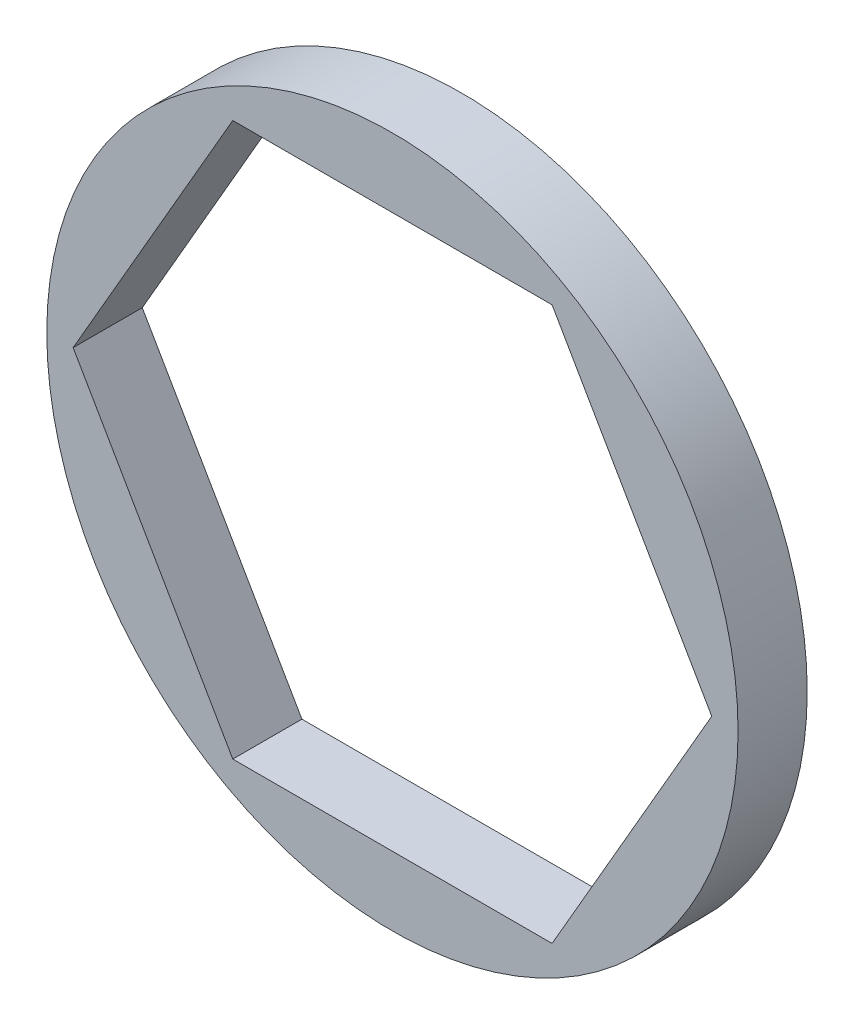
ISO-10303-21;
HEADER;
FILE_DESCRIPTION(('STEP AP214'),'2;1');
FILE_NAME('part.step','',(''),(''),'','','');
FILE_SCHEMA(('AUTOMOTIVE_DESIGN { 1 0 10303 214 1 1 1 1 }'));
ENDSEC;
DATA;
#1=APPLICATION_CONTEXT('core data for automotive mechanical design processes');
#2=APPLICATION_PROTOCOL_DEFINITION('international standard','automotive_design',2000,#1);
#3=PRODUCT_CONTEXT('',#1,'mechanical');
#4=PRODUCT('Part','Part','',(#3));
#5=PRODUCT_RELATED_PRODUCT_CATEGORY('part','',(#4));
#6=PRODUCT_DEFINITION_FORMATION('','',#4);
#7=PRODUCT_DEFINITION_CONTEXT('part definition',#1,'design');
#8=PRODUCT_DEFINITION('design','',#6,#7);
#9=PRODUCT_DEFINITION_SHAPE('','',#8);
#10=(LENGTH_UNIT() NAMED_UNIT(*) SI_UNIT(.MILLI.,.METRE.));
#11=(NAMED_UNIT(*) PLANE_ANGLE_UNIT() SI_UNIT($,.RADIAN.));
#12=(NAMED_UNIT(*) SI_UNIT($,.STERADIAN.) SOLID_ANGLE_UNIT());
#13=UNCERTAINTY_MEASURE_WITH_UNIT(LENGTH_MEASURE(1.E-05),#10,'distance_accuracy_value','');
#14=(GEOMETRIC_REPRESENTATION_CONTEXT(3) GLOBAL_UNCERTAINTY_ASSIGNED_CONTEXT((#13)) GLOBAL_UNIT_ASSIGNED_CONTEXT((#10,
#11,#12)) REPRESENTATION_CONTEXT('',''));
#15=CARTESIAN_POINT('',(0.,0.,0.));
#16=DIRECTION('',(0.,0.,1.));
#17=DIRECTION('',(1.,0.,0.));
#18=AXIS2_PLACEMENT_3D('',#15,#16,#17);
#19=CARTESIAN_POINT('',(0.,0.,1.5875));
#20=DIRECTION('',(0.,0.,1.));
#21=DIRECTION('',(1.,0.,0.));
#22=AXIS2_PLACEMENT_3D('',#19,#20,#21);
#23=PLANE('',#22);
#24=CARTESIAN_POINT('',(0.,0.,1.5875));
#25=DIRECTION('',(0.,0.,1.));
#26=DIRECTION('',(1.,0.,0.));
#27=AXIS2_PLACEMENT_3D('',#24,#25,#26);
#28=CIRCLE('',#27,7.9375);
#29=CARTESIAN_POINT('',(7.9375,0.,1.5875));
#30=VERTEX_POINT('',#29);
#31=EDGE_CURVE('E11',#30,#30,#28,.T.);
#32=ORIENTED_EDGE('',*,*,#31,.T.);
#33=EDGE_LOOP('',(#32));
#34=FACE_BOUND('',#33,.T.);
#35=DIRECTION('',(1.,0.,0.));
#36=VECTOR('',#35,1.);
#37=CARTESIAN_POINT('',(-3.66617420935412,-6.35,1.5875));
#38=LINE('',#37,#36);
#39=CARTESIAN_POINT('',(-3.66617420935412,-6.35,1.5875));
#40=VERTEX_POINT('',#39);
#41=CARTESIAN_POINT('',(3.66617420935412,-6.35,1.5875));
#42=VERTEX_POINT('',#41);
#43=EDGE_CURVE('E94',#40,#42,#38,.T.);
#44=ORIENTED_EDGE('',*,*,#43,.F.);
#45=DIRECTION('',(0.5,-0.866025403784438,0.));
#46=VECTOR('',#45,1.);
#47=CARTESIAN_POINT('',(-7.33234841870825,0.,1.5875));
#48=LINE('',#47,#46);
#49=CARTESIAN_POINT('',(-7.33234841870825,0.,1.5875));
#50=VERTEX_POINT('',#49);
#51=EDGE_CURVE('E86',#50,#40,#48,.T.);
#52=ORIENTED_EDGE('',*,*,#51,.F.);
#53=DIRECTION('',(-0.5,-0.866025403784439,0.));
#54=VECTOR('',#53,1.);
#55=CARTESIAN_POINT('',(-3.66617420935412,6.35,1.5875));
#56=LINE('',#55,#54);
#57=CARTESIAN_POINT('',(-3.66617420935412,6.35,1.5875));
#58=VERTEX_POINT('',#57);
#59=EDGE_CURVE('E114',#58,#50,#56,.T.);
#60=ORIENTED_EDGE('',*,*,#59,.F.);
#61=DIRECTION('',(-1.,0.,0.));
#62=VECTOR('',#61,1.);
#63=CARTESIAN_POINT('',(3.66617420935412,6.35,1.5875));
#64=LINE('',#63,#62);
#65=CARTESIAN_POINT('',(3.66617420935412,6.35,1.5875));
#66=VERTEX_POINT('',#65);
#67=EDGE_CURVE('E112',#66,#58,#64,.T.);
#68=ORIENTED_EDGE('',*,*,#67,.F.);
#69=DIRECTION('',(-0.5,0.866025403784438,0.));
#70=VECTOR('',#69,1.);
#71=CARTESIAN_POINT('',(7.33234841870824,0.,1.5875));
#72=LINE('',#71,#70);
#73=CARTESIAN_POINT('',(7.33234841870824,0.,1.5875));
#74=VERTEX_POINT('',#73);
#75=EDGE_CURVE('E108',#74,#66,#72,.T.);
#76=ORIENTED_EDGE('',*,*,#75,.F.);
#77=DIRECTION('',(0.5,0.866025403784439,0.));
#78=VECTOR('',#77,1.);
#79=CARTESIAN_POINT('',(3.66617420935412,-6.35,1.5875));
#80=LINE('',#79,#78);
#81=EDGE_CURVE('E106',#42,#74,#80,.T.);
#82=ORIENTED_EDGE('',*,*,#81,.F.);
#83=EDGE_LOOP('',(#44,#52,#60,#68,#76,#82));
#84=FACE_BOUND('',#83,.T.);
#85=ADVANCED_FACE('F33',(#34,#84),#23,.T.);
#86=CARTESIAN_POINT('',(0.,0.,0.));
#87=DIRECTION('',(0.,0.,1.));
#88=DIRECTION('',(1.,0.,0.));
#89=AXIS2_PLACEMENT_3D('',#86,#87,#88);
#90=PLANE('',#89);
#91=CARTESIAN_POINT('',(0.,0.,0.));
#92=DIRECTION('',(0.,0.,1.));
#93=DIRECTION('',(1.,0.,0.));
#94=AXIS2_PLACEMENT_3D('',#91,#92,#93);
#95=CIRCLE('',#94,7.9375);
#96=CARTESIAN_POINT('',(7.9375,0.,0.));
#97=VERTEX_POINT('',#96);
#98=EDGE_CURVE('E37',#97,#97,#95,.T.);
#99=ORIENTED_EDGE('',*,*,#98,.F.);
#100=EDGE_LOOP('',(#99));
#101=FACE_BOUND('',#100,.T.);
#102=DIRECTION('',(0.5,-0.866025403784438,0.));
#103=VECTOR('',#102,1.);
#104=CARTESIAN_POINT('',(-7.33234841870825,0.,0.));
#105=LINE('',#104,#103);
#106=CARTESIAN_POINT('',(-7.33234841870825,0.,0.));
#107=VERTEX_POINT('',#106);
#108=CARTESIAN_POINT('',(-3.66617420935412,-6.35,0.));
#109=VERTEX_POINT('',#108);
#110=EDGE_CURVE('E56',#107,#109,#105,.T.);
#111=ORIENTED_EDGE('',*,*,#110,.T.);
#112=DIRECTION('',(1.,0.,0.));
#113=VECTOR('',#112,1.);
#114=CARTESIAN_POINT('',(-3.66617420935412,-6.35,0.));
#115=LINE('',#114,#113);
#116=CARTESIAN_POINT('',(3.66617420935412,-6.35,0.));
#117=VERTEX_POINT('',#116);
#118=EDGE_CURVE('E101',#109,#117,#115,.T.);
#119=ORIENTED_EDGE('',*,*,#118,.T.);
#120=DIRECTION('',(0.5,0.866025403784439,0.));
#121=VECTOR('',#120,1.);
#122=CARTESIAN_POINT('',(3.66617420935412,-6.35,0.));
#123=LINE('',#122,#121);
#124=CARTESIAN_POINT('',(7.33234841870824,0.,0.));
#125=VERTEX_POINT('',#124);
#126=EDGE_CURVE('E118',#117,#125,#123,.T.);
#127=ORIENTED_EDGE('',*,*,#126,.T.);
#128=DIRECTION('',(-0.5,0.866025403784438,0.));
#129=VECTOR('',#128,1.);
#130=CARTESIAN_POINT('',(7.33234841870824,0.,0.));
#131=LINE('',#130,#129);
#132=CARTESIAN_POINT('',(3.66617420935412,6.35,0.));
#133=VERTEX_POINT('',#132);
#134=EDGE_CURVE('E121',#125,#133,#131,.T.);
#135=ORIENTED_EDGE('',*,*,#134,.T.);
#136=DIRECTION('',(-1.,0.,0.));
#137=VECTOR('',#136,1.);
#138=CARTESIAN_POINT('',(3.66617420935412,6.35,0.));
#139=LINE('',#138,#137);
#140=CARTESIAN_POINT('',(-3.66617420935412,6.35,0.));
#141=VERTEX_POINT('',#140);
#142=EDGE_CURVE('E124',#133,#141,#139,.T.);
#143=ORIENTED_EDGE('',*,*,#142,.T.);
#144=DIRECTION('',(-0.5,-0.866025403784439,0.));
#145=VECTOR('',#144,1.);
#146=CARTESIAN_POINT('',(-3.66617420935412,6.35,0.));
#147=LINE('',#146,#145);
#148=EDGE_CURVE('E95',#141,#107,#147,.T.);
#149=ORIENTED_EDGE('',*,*,#148,.T.);
#150=EDGE_LOOP('',(#111,#119,#127,#135,#143,#149));
#151=FACE_BOUND('',#150,.T.);
#152=ADVANCED_FACE('F141',(#101,#151),#90,.F.);
#153=CARTESIAN_POINT('',(0.,0.,1.5875));
#154=DIRECTION('',(0.,0.,-1.));
#155=DIRECTION('',(-1.,0.,0.));
#156=AXIS2_PLACEMENT_3D('',#153,#154,#155);
#157=CYLINDRICAL_SURFACE('',#156,7.9375);
#158=ORIENTED_EDGE('',*,*,#31,.F.);
#159=EDGE_LOOP('',(#158));
#160=FACE_BOUND('',#159,.T.);
#161=ORIENTED_EDGE('',*,*,#98,.T.);
#162=EDGE_LOOP('',(#161));
#163=FACE_BOUND('',#162,.T.);
#164=ADVANCED_FACE('F35',(#160,#163),#157,.T.);
#165=CARTESIAN_POINT('',(-7.33234841870825,0.,1.5875));
#166=DIRECTION('',(0.866025403784439,0.5,0.));
#167=DIRECTION('',(-0.5,0.866025403784439,0.));
#168=AXIS2_PLACEMENT_3D('',#165,#166,#167);
#169=PLANE('',#168);
#170=ORIENTED_EDGE('',*,*,#110,.F.);
#171=DIRECTION('',(0.,0.,-1.));
#172=VECTOR('',#171,1.);
#173=CARTESIAN_POINT('',(-7.33234841870825,0.,1.5875));
#174=LINE('',#173,#172);
#175=EDGE_CURVE('E90',#50,#107,#174,.T.);
#176=ORIENTED_EDGE('',*,*,#175,.F.);
#177=ORIENTED_EDGE('',*,*,#51,.T.);
#178=DIRECTION('',(0.,0.,-1.));
#179=VECTOR('',#178,1.);
#180=CARTESIAN_POINT('',(-3.66617420935412,-6.35,1.5875));
#181=LINE('',#180,#179);
#182=EDGE_CURVE('E89',#40,#109,#181,.T.);
#183=ORIENTED_EDGE('',*,*,#182,.T.);
#184=EDGE_LOOP('',(#170,#176,#177,#183));
#185=FACE_BOUND('',#184,.T.);
#186=ADVANCED_FACE('F88',(#185),#169,.T.);
#187=CARTESIAN_POINT('',(-3.66617420935412,-6.35,1.5875));
#188=DIRECTION('',(0.,1.,0.));
#189=DIRECTION('',(-1.,0.,0.));
#190=AXIS2_PLACEMENT_3D('',#187,#188,#189);
#191=PLANE('',#190);
#192=ORIENTED_EDGE('',*,*,#118,.F.);
#193=ORIENTED_EDGE('',*,*,#182,.F.);
#194=ORIENTED_EDGE('',*,*,#43,.T.);
#195=DIRECTION('',(0.,0.,-1.));
#196=VECTOR('',#195,1.);
#197=CARTESIAN_POINT('',(3.66617420935412,-6.35,1.5875));
#198=LINE('',#197,#196);
#199=EDGE_CURVE('E102',#42,#117,#198,.T.);
#200=ORIENTED_EDGE('',*,*,#199,.T.);
#201=EDGE_LOOP('',(#192,#193,#194,#200));
#202=FACE_BOUND('',#201,.T.);
#203=ADVANCED_FACE('F98',(#202),#191,.T.);
#204=CARTESIAN_POINT('',(3.66617420935412,-6.35,1.5875));
#205=DIRECTION('',(-0.866025403784439,0.5,0.));
#206=DIRECTION('',(-0.5,-0.866025403784439,0.));
#207=AXIS2_PLACEMENT_3D('',#204,#205,#206);
#208=PLANE('',#207);
#209=ORIENTED_EDGE('',*,*,#126,.F.);
#210=ORIENTED_EDGE('',*,*,#199,.F.);
#211=ORIENTED_EDGE('',*,*,#81,.T.);
#212=DIRECTION('',(0.,0.,-1.));
#213=VECTOR('',#212,1.);
#214=CARTESIAN_POINT('',(7.33234841870824,0.,1.5875));
#215=LINE('',#214,#213);
#216=EDGE_CURVE('E133',#74,#125,#215,.T.);
#217=ORIENTED_EDGE('',*,*,#216,.T.);
#218=EDGE_LOOP('',(#209,#210,#211,#217));
#219=FACE_BOUND('',#218,.T.);
#220=ADVANCED_FACE('F137',(#219),#208,.T.);
#221=CARTESIAN_POINT('',(7.33234841870824,0.,1.5875));
#222=DIRECTION('',(-0.866025403784438,-0.5,0.));
#223=DIRECTION('',(0.500000000000001,-0.866025403784438,0.));
#224=AXIS2_PLACEMENT_3D('',#221,#222,#223);
#225=PLANE('',#224);
#226=ORIENTED_EDGE('',*,*,#134,.F.);
#227=ORIENTED_EDGE('',*,*,#216,.F.);
#228=ORIENTED_EDGE('',*,*,#75,.T.);
#229=DIRECTION('',(0.,0.,-1.));
#230=VECTOR('',#229,1.);
#231=CARTESIAN_POINT('',(3.66617420935412,6.35,1.5875));
#232=LINE('',#231,#230);
#233=EDGE_CURVE('E131',#66,#133,#232,.T.);
#234=ORIENTED_EDGE('',*,*,#233,.T.);
#235=EDGE_LOOP('',(#226,#227,#228,#234));
#236=FACE_BOUND('',#235,.T.);
#237=ADVANCED_FACE('F149',(#236),#225,.T.);
#238=CARTESIAN_POINT('',(3.66617420935412,6.35,1.5875));
#239=DIRECTION('',(0.,-1.,0.));
#240=DIRECTION('',(1.,0.,0.));
#241=AXIS2_PLACEMENT_3D('',#238,#239,#240);
#242=PLANE('',#241);
#243=ORIENTED_EDGE('',*,*,#142,.F.);
#244=ORIENTED_EDGE('',*,*,#233,.F.);
#245=ORIENTED_EDGE('',*,*,#67,.T.);
#246=DIRECTION('',(0.,0.,-1.));
#247=VECTOR('',#246,1.);
#248=CARTESIAN_POINT('',(-3.66617420935412,6.35,1.5875));
#249=LINE('',#248,#247);
#250=EDGE_CURVE('E48',#58,#141,#249,.T.);
#251=ORIENTED_EDGE('',*,*,#250,.T.);
#252=EDGE_LOOP('',(#243,#244,#245,#251));
#253=FACE_BOUND('',#252,.T.);
#254=ADVANCED_FACE('F147',(#253),#242,.T.);
#255=CARTESIAN_POINT('',(-3.66617420935412,6.35,1.5875));
#256=DIRECTION('',(0.866025403784439,-0.5,0.));
#257=DIRECTION('',(0.5,0.866025403784439,0.));
#258=AXIS2_PLACEMENT_3D('',#255,#256,#257);
#259=PLANE('',#258);
#260=ORIENTED_EDGE('',*,*,#148,.F.);
#261=ORIENTED_EDGE('',*,*,#250,.F.);
#262=ORIENTED_EDGE('',*,*,#59,.T.);
#263=ORIENTED_EDGE('',*,*,#175,.T.);
#264=EDGE_LOOP('',(#260,#261,#262,#263));
#265=FACE_BOUND('',#264,.T.);
#266=ADVANCED_FACE('F143',(#265),#259,.T.);
#267=CLOSED_SHELL('',(#85,#152,#164,#186,#203,#220,#237,#254,#266));
#268=MANIFOLD_SOLID_BREP('B2',#267);
#269=ADVANCED_BREP_SHAPE_REPRESENTATION('',(#18,#268),#14);
#270=SHAPE_DEFINITION_REPRESENTATION(#9,#269);
ENDSEC;
END-ISO-10303-21;
